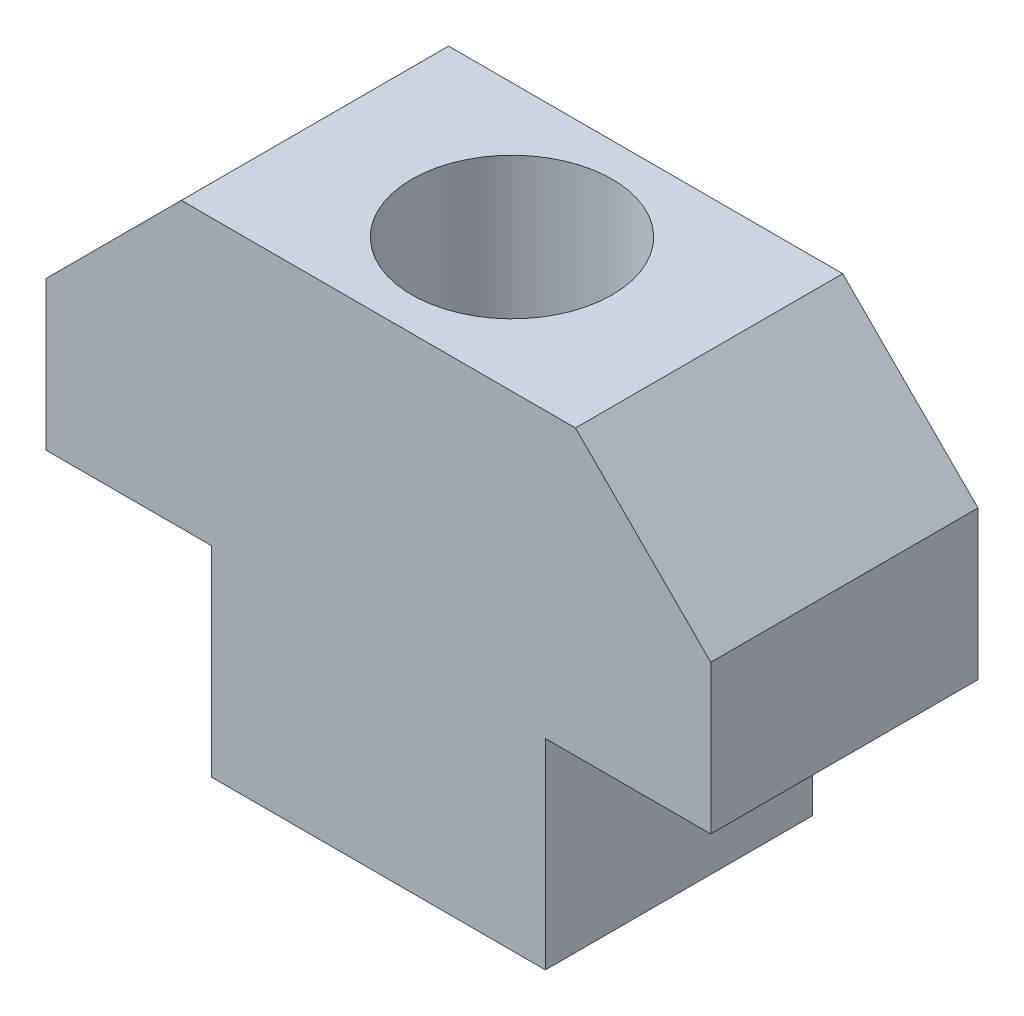
ISO-10303-21;
HEADER;
FILE_DESCRIPTION(('STEP AP214'),'2;1');
FILE_NAME('part.step','',(''),(''),'','','');
FILE_SCHEMA(('AUTOMOTIVE_DESIGN { 1 0 10303 214 1 1 1 1 }'));
ENDSEC;
DATA;
#1=APPLICATION_CONTEXT('core data for automotive mechanical design processes');
#2=APPLICATION_PROTOCOL_DEFINITION('international standard','automotive_design',2000,#1);
#3=PRODUCT_CONTEXT('',#1,'mechanical');
#4=PRODUCT('Part','Part','',(#3));
#5=PRODUCT_RELATED_PRODUCT_CATEGORY('part','',(#4));
#6=PRODUCT_DEFINITION_FORMATION('','',#4);
#7=PRODUCT_DEFINITION_CONTEXT('part definition',#1,'design');
#8=PRODUCT_DEFINITION('design','',#6,#7);
#9=PRODUCT_DEFINITION_SHAPE('','',#8);
#10=(LENGTH_UNIT() NAMED_UNIT(*) SI_UNIT(.MILLI.,.METRE.));
#11=(NAMED_UNIT(*) PLANE_ANGLE_UNIT() SI_UNIT($,.RADIAN.));
#12=(NAMED_UNIT(*) SI_UNIT($,.STERADIAN.) SOLID_ANGLE_UNIT());
#13=UNCERTAINTY_MEASURE_WITH_UNIT(LENGTH_MEASURE(1.E-05),#10,'distance_accuracy_value','');
#14=(GEOMETRIC_REPRESENTATION_CONTEXT(3) GLOBAL_UNCERTAINTY_ASSIGNED_CONTEXT((#13)) GLOBAL_UNIT_ASSIGNED_CONTEXT((#10,
#11,#12)) REPRESENTATION_CONTEXT('',''));
#15=CARTESIAN_POINT('',(0.,0.,0.));
#16=DIRECTION('',(0.,0.,1.));
#17=DIRECTION('',(1.,0.,0.));
#18=AXIS2_PLACEMENT_3D('',#15,#16,#17);
#19=CARTESIAN_POINT('',(5.9,14.5,4.));
#20=DIRECTION('',(0.,-1.,0.));
#21=DIRECTION('',(1.,0.,0.));
#22=AXIS2_PLACEMENT_3D('',#19,#20,#21);
#23=PLANE('',#22);
#24=DIRECTION('',(-1.,0.,0.));
#25=VECTOR('',#24,1.);
#26=CARTESIAN_POINT('',(5.9,14.5,-4.));
#27=LINE('',#26,#25);
#28=CARTESIAN_POINT('',(5.9,14.5,-4.));
#29=VERTEX_POINT('',#28);
#30=CARTESIAN_POINT('',(-5.9,14.5,-4.));
#31=VERTEX_POINT('',#30);
#32=EDGE_CURVE('E153',#29,#31,#27,.T.);
#33=ORIENTED_EDGE('',*,*,#32,.T.);
#34=DIRECTION('',(0.,0.,-1.));
#35=VECTOR('',#34,1.);
#36=CARTESIAN_POINT('',(-5.9,14.5,4.));
#37=LINE('',#36,#35);
#38=CARTESIAN_POINT('',(-5.9,14.5,4.));
#39=VERTEX_POINT('',#38);
#40=EDGE_CURVE('E169',#39,#31,#37,.T.);
#41=ORIENTED_EDGE('',*,*,#40,.F.);
#42=DIRECTION('',(-1.,0.,0.));
#43=VECTOR('',#42,1.);
#44=CARTESIAN_POINT('',(5.9,14.5,4.));
#45=LINE('',#44,#43);
#46=CARTESIAN_POINT('',(5.9,14.5,4.));
#47=VERTEX_POINT('',#46);
#48=EDGE_CURVE('E198',#47,#39,#45,.T.);
#49=ORIENTED_EDGE('',*,*,#48,.F.);
#50=DIRECTION('',(0.,0.,-1.));
#51=VECTOR('',#50,1.);
#52=CARTESIAN_POINT('',(5.9,14.5,4.));
#53=LINE('',#52,#51);
#54=EDGE_CURVE('E172',#47,#29,#53,.T.);
#55=ORIENTED_EDGE('',*,*,#54,.T.);
#56=EDGE_LOOP('',(#33,#41,#49,#55));
#57=FACE_BOUND('',#56,.T.);
#58=CARTESIAN_POINT('',(0.,14.5,0.));
#59=DIRECTION('',(0.,-1.,0.));
#60=DIRECTION('',(1.,0.,0.));
#61=AXIS2_PLACEMENT_3D('',#58,#59,#60);
#62=CIRCLE('',#61,3.);
#63=CARTESIAN_POINT('',(3.,14.5,0.));
#64=VERTEX_POINT('',#63);
#65=EDGE_CURVE('E209',#64,#64,#62,.T.);
#66=ORIENTED_EDGE('',*,*,#65,.T.);
#67=EDGE_LOOP('',(#66));
#68=FACE_BOUND('',#67,.T.);
#69=ADVANCED_FACE('F34',(#57,#68),#23,.F.);
#70=CARTESIAN_POINT('',(-5.,0.,4.));
#71=DIRECTION('',(0.,1.,0.));
#72=DIRECTION('',(-1.,0.,0.));
#73=AXIS2_PLACEMENT_3D('',#70,#71,#72);
#74=PLANE('',#73);
#75=DIRECTION('',(1.,0.,0.));
#76=VECTOR('',#75,1.);
#77=CARTESIAN_POINT('',(-5.,0.,-4.));
#78=LINE('',#77,#76);
#79=CARTESIAN_POINT('',(-5.,0.,-4.));
#80=VERTEX_POINT('',#79);
#81=CARTESIAN_POINT('',(5.,0.,-4.));
#82=VERTEX_POINT('',#81);
#83=EDGE_CURVE('E92',#80,#82,#78,.T.);
#84=ORIENTED_EDGE('',*,*,#83,.T.);
#85=DIRECTION('',(0.,0.,-1.));
#86=VECTOR('',#85,1.);
#87=CARTESIAN_POINT('',(5.,0.,4.));
#88=LINE('',#87,#86);
#89=CARTESIAN_POINT('',(5.,0.,4.));
#90=VERTEX_POINT('',#89);
#91=EDGE_CURVE('E139',#90,#82,#88,.T.);
#92=ORIENTED_EDGE('',*,*,#91,.F.);
#93=DIRECTION('',(1.,0.,0.));
#94=VECTOR('',#93,1.);
#95=CARTESIAN_POINT('',(-5.,0.,4.));
#96=LINE('',#95,#94);
#97=CARTESIAN_POINT('',(-5.,0.,4.));
#98=VERTEX_POINT('',#97);
#99=EDGE_CURVE('E51',#98,#90,#96,.T.);
#100=ORIENTED_EDGE('',*,*,#99,.F.);
#101=DIRECTION('',(0.,0.,-1.));
#102=VECTOR('',#101,1.);
#103=CARTESIAN_POINT('',(-5.,0.,4.));
#104=LINE('',#103,#102);
#105=EDGE_CURVE('E135',#98,#80,#104,.T.);
#106=ORIENTED_EDGE('',*,*,#105,.T.);
#107=EDGE_LOOP('',(#84,#92,#100,#106));
#108=FACE_BOUND('',#107,.T.);
#109=CARTESIAN_POINT('',(0.,0.,0.));
#110=DIRECTION('',(0.,1.,0.));
#111=DIRECTION('',(0.,0.,1.));
#112=AXIS2_PLACEMENT_3D('',#109,#110,#111);
#113=CIRCLE('',#112,3.);
#114=CARTESIAN_POINT('',(0.,0.,3.));
#115=VERTEX_POINT('',#114);
#116=EDGE_CURVE('E147',#115,#115,#113,.T.);
#117=ORIENTED_EDGE('',*,*,#116,.T.);
#118=EDGE_LOOP('',(#117));
#119=FACE_BOUND('',#118,.T.);
#120=ADVANCED_FACE('F215',(#108,#119),#74,.F.);
#121=CARTESIAN_POINT('',(5.,0.,4.));
#122=DIRECTION('',(-1.,0.,0.));
#123=DIRECTION('',(0.,0.,1.));
#124=AXIS2_PLACEMENT_3D('',#121,#122,#123);
#125=PLANE('',#124);
#126=DIRECTION('',(0.,1.,0.));
#127=VECTOR('',#126,1.);
#128=CARTESIAN_POINT('',(5.,0.,-4.));
#129=LINE('',#128,#127);
#130=CARTESIAN_POINT('',(5.,6.,-4.));
#131=VERTEX_POINT('',#130);
#132=EDGE_CURVE('E143',#82,#131,#129,.T.);
#133=ORIENTED_EDGE('',*,*,#132,.T.);
#134=DIRECTION('',(0.,0.,-1.));
#135=VECTOR('',#134,1.);
#136=CARTESIAN_POINT('',(5.,6.,4.));
#137=LINE('',#136,#135);
#138=CARTESIAN_POINT('',(5.,6.,4.));
#139=VERTEX_POINT('',#138);
#140=EDGE_CURVE('E11',#139,#131,#137,.T.);
#141=ORIENTED_EDGE('',*,*,#140,.F.);
#142=DIRECTION('',(0.,1.,0.));
#143=VECTOR('',#142,1.);
#144=CARTESIAN_POINT('',(5.,0.,4.));
#145=LINE('',#144,#143);
#146=EDGE_CURVE('E162',#90,#139,#145,.T.);
#147=ORIENTED_EDGE('',*,*,#146,.F.);
#148=ORIENTED_EDGE('',*,*,#91,.T.);
#149=EDGE_LOOP('',(#133,#141,#147,#148));
#150=FACE_BOUND('',#149,.T.);
#151=ADVANCED_FACE('F36',(#150),#125,.F.);
#152=CARTESIAN_POINT('',(5.,6.,4.));
#153=DIRECTION('',(0.,1.,0.));
#154=DIRECTION('',(-1.,0.,0.));
#155=AXIS2_PLACEMENT_3D('',#152,#153,#154);
#156=PLANE('',#155);
#157=DIRECTION('',(1.,0.,0.));
#158=VECTOR('',#157,1.);
#159=CARTESIAN_POINT('',(5.,6.,-4.));
#160=LINE('',#159,#158);
#161=CARTESIAN_POINT('',(9.95,6.,-4.));
#162=VERTEX_POINT('',#161);
#163=EDGE_CURVE('E146',#131,#162,#160,.T.);
#164=ORIENTED_EDGE('',*,*,#163,.T.);
#165=DIRECTION('',(0.,0.,-1.));
#166=VECTOR('',#165,1.);
#167=CARTESIAN_POINT('',(9.95,6.,4.));
#168=LINE('',#167,#166);
#169=CARTESIAN_POINT('',(9.95,6.,4.));
#170=VERTEX_POINT('',#169);
#171=EDGE_CURVE('E43',#170,#162,#168,.T.);
#172=ORIENTED_EDGE('',*,*,#171,.F.);
#173=DIRECTION('',(1.,0.,0.));
#174=VECTOR('',#173,1.);
#175=CARTESIAN_POINT('',(5.,6.,4.));
#176=LINE('',#175,#174);
#177=EDGE_CURVE('E100',#139,#170,#176,.T.);
#178=ORIENTED_EDGE('',*,*,#177,.F.);
#179=ORIENTED_EDGE('',*,*,#140,.T.);
#180=EDGE_LOOP('',(#164,#172,#178,#179));
#181=FACE_BOUND('',#180,.T.);
#182=ADVANCED_FACE('F235',(#181),#156,.F.);
#183=CARTESIAN_POINT('',(9.95,6.,4.));
#184=DIRECTION('',(-1.,0.,0.));
#185=DIRECTION('',(0.,-1.,0.));
#186=AXIS2_PLACEMENT_3D('',#183,#184,#185);
#187=PLANE('',#186);
#188=DIRECTION('',(0.,1.,0.));
#189=VECTOR('',#188,1.);
#190=CARTESIAN_POINT('',(9.95,6.,-4.));
#191=LINE('',#190,#189);
#192=CARTESIAN_POINT('',(9.95,10.45,-4.));
#193=VERTEX_POINT('',#192);
#194=EDGE_CURVE('E149',#162,#193,#191,.T.);
#195=ORIENTED_EDGE('',*,*,#194,.T.);
#196=DIRECTION('',(0.,0.,-1.));
#197=VECTOR('',#196,1.);
#198=CARTESIAN_POINT('',(9.95,10.45,4.));
#199=LINE('',#198,#197);
#200=CARTESIAN_POINT('',(9.95,10.45,4.));
#201=VERTEX_POINT('',#200);
#202=EDGE_CURVE('E175',#201,#193,#199,.T.);
#203=ORIENTED_EDGE('',*,*,#202,.F.);
#204=DIRECTION('',(0.,1.,0.));
#205=VECTOR('',#204,1.);
#206=CARTESIAN_POINT('',(9.95,6.,4.));
#207=LINE('',#206,#205);
#208=EDGE_CURVE('E183',#170,#201,#207,.T.);
#209=ORIENTED_EDGE('',*,*,#208,.F.);
#210=ORIENTED_EDGE('',*,*,#171,.T.);
#211=EDGE_LOOP('',(#195,#203,#209,#210));
#212=FACE_BOUND('',#211,.T.);
#213=ADVANCED_FACE('F181',(#212),#187,.F.);
#214=CARTESIAN_POINT('',(9.95,10.45,4.));
#215=DIRECTION('',(-0.707106781186549,-0.707106781186546,0.));
#216=DIRECTION('',(0.707106781186546,-0.707106781186549,0.));
#217=AXIS2_PLACEMENT_3D('',#214,#215,#216);
#218=PLANE('',#217);
#219=DIRECTION('',(-0.707106781186546,0.707106781186549,0.));
#220=VECTOR('',#219,1.);
#221=CARTESIAN_POINT('',(9.95,10.45,-4.));
#222=LINE('',#221,#220);
#223=EDGE_CURVE('E151',#193,#29,#222,.T.);
#224=ORIENTED_EDGE('',*,*,#223,.T.);
#225=ORIENTED_EDGE('',*,*,#54,.F.);
#226=DIRECTION('',(-0.707106781186546,0.707106781186549,0.));
#227=VECTOR('',#226,1.);
#228=CARTESIAN_POINT('',(9.95,10.45,4.));
#229=LINE('',#228,#227);
#230=EDGE_CURVE('E201',#201,#47,#229,.T.);
#231=ORIENTED_EDGE('',*,*,#230,.F.);
#232=ORIENTED_EDGE('',*,*,#202,.T.);
#233=EDGE_LOOP('',(#224,#225,#231,#232));
#234=FACE_BOUND('',#233,.T.);
#235=ADVANCED_FACE('F192',(#234),#218,.F.);
#236=CARTESIAN_POINT('',(-5.9,14.5,4.));
#237=DIRECTION('',(0.707106781186549,-0.707106781186546,0.));
#238=DIRECTION('',(0.707106781186546,0.707106781186549,0.));
#239=AXIS2_PLACEMENT_3D('',#236,#237,#238);
#240=PLANE('',#239);
#241=DIRECTION('',(-0.707106781186546,-0.707106781186549,0.));
#242=VECTOR('',#241,1.);
#243=CARTESIAN_POINT('',(-5.9,14.5,-4.));
#244=LINE('',#243,#242);
#245=CARTESIAN_POINT('',(-9.95,10.45,-4.));
#246=VERTEX_POINT('',#245);
#247=EDGE_CURVE('E155',#31,#246,#244,.T.);
#248=ORIENTED_EDGE('',*,*,#247,.T.);
#249=DIRECTION('',(0.,0.,-1.));
#250=VECTOR('',#249,1.);
#251=CARTESIAN_POINT('',(-9.95,10.45,4.));
#252=LINE('',#251,#250);
#253=CARTESIAN_POINT('',(-9.95,10.45,4.));
#254=VERTEX_POINT('',#253);
#255=EDGE_CURVE('E166',#254,#246,#252,.T.);
#256=ORIENTED_EDGE('',*,*,#255,.F.);
#257=DIRECTION('',(-0.707106781186546,-0.707106781186549,0.));
#258=VECTOR('',#257,1.);
#259=CARTESIAN_POINT('',(-5.9,14.5,4.));
#260=LINE('',#259,#258);
#261=EDGE_CURVE('E200',#39,#254,#260,.T.);
#262=ORIENTED_EDGE('',*,*,#261,.F.);
#263=ORIENTED_EDGE('',*,*,#40,.T.);
#264=EDGE_LOOP('',(#248,#256,#262,#263));
#265=FACE_BOUND('',#264,.T.);
#266=ADVANCED_FACE('F230',(#265),#240,.F.);
#267=CARTESIAN_POINT('',(-9.95,10.45,4.));
#268=DIRECTION('',(1.,0.,0.));
#269=DIRECTION('',(0.,1.,0.));
#270=AXIS2_PLACEMENT_3D('',#267,#268,#269);
#271=PLANE('',#270);
#272=DIRECTION('',(0.,-1.,0.));
#273=VECTOR('',#272,1.);
#274=CARTESIAN_POINT('',(-9.95,10.45,-4.));
#275=LINE('',#274,#273);
#276=CARTESIAN_POINT('',(-9.95,6.,-4.));
#277=VERTEX_POINT('',#276);
#278=EDGE_CURVE('E157',#246,#277,#275,.T.);
#279=ORIENTED_EDGE('',*,*,#278,.T.);
#280=DIRECTION('',(0.,0.,-1.));
#281=VECTOR('',#280,1.);
#282=CARTESIAN_POINT('',(-9.95,6.,4.));
#283=LINE('',#282,#281);
#284=CARTESIAN_POINT('',(-9.95,6.,4.));
#285=VERTEX_POINT('',#284);
#286=EDGE_CURVE('E134',#285,#277,#283,.T.);
#287=ORIENTED_EDGE('',*,*,#286,.F.);
#288=DIRECTION('',(0.,-1.,0.));
#289=VECTOR('',#288,1.);
#290=CARTESIAN_POINT('',(-9.95,10.45,4.));
#291=LINE('',#290,#289);
#292=EDGE_CURVE('E125',#254,#285,#291,.T.);
#293=ORIENTED_EDGE('',*,*,#292,.F.);
#294=ORIENTED_EDGE('',*,*,#255,.T.);
#295=EDGE_LOOP('',(#279,#287,#293,#294));
#296=FACE_BOUND('',#295,.T.);
#297=ADVANCED_FACE('F245',(#296),#271,.F.);
#298=CARTESIAN_POINT('',(-9.95,6.,4.));
#299=DIRECTION('',(0.,1.,0.));
#300=DIRECTION('',(0.,0.,1.));
#301=AXIS2_PLACEMENT_3D('',#298,#299,#300);
#302=PLANE('',#301);
#303=DIRECTION('',(1.,0.,0.));
#304=VECTOR('',#303,1.);
#305=CARTESIAN_POINT('',(-9.95,6.,-4.));
#306=LINE('',#305,#304);
#307=CARTESIAN_POINT('',(-5.,6.,-4.));
#308=VERTEX_POINT('',#307);
#309=EDGE_CURVE('E133',#277,#308,#306,.T.);
#310=ORIENTED_EDGE('',*,*,#309,.T.);
#311=DIRECTION('',(0.,0.,-1.));
#312=VECTOR('',#311,1.);
#313=CARTESIAN_POINT('',(-5.,6.,4.));
#314=LINE('',#313,#312);
#315=CARTESIAN_POINT('',(-5.,6.,4.));
#316=VERTEX_POINT('',#315);
#317=EDGE_CURVE('E130',#316,#308,#314,.T.);
#318=ORIENTED_EDGE('',*,*,#317,.F.);
#319=DIRECTION('',(1.,0.,0.));
#320=VECTOR('',#319,1.);
#321=CARTESIAN_POINT('',(-9.95,6.,4.));
#322=LINE('',#321,#320);
#323=EDGE_CURVE('E119',#285,#316,#322,.T.);
#324=ORIENTED_EDGE('',*,*,#323,.F.);
#325=ORIENTED_EDGE('',*,*,#286,.T.);
#326=EDGE_LOOP('',(#310,#318,#324,#325));
#327=FACE_BOUND('',#326,.T.);
#328=ADVANCED_FACE('F131',(#327),#302,.F.);
#329=CARTESIAN_POINT('',(-5.,6.,4.));
#330=DIRECTION('',(1.,0.,0.));
#331=DIRECTION('',(0.,1.,0.));
#332=AXIS2_PLACEMENT_3D('',#329,#330,#331);
#333=PLANE('',#332);
#334=DIRECTION('',(0.,-1.,0.));
#335=VECTOR('',#334,1.);
#336=CARTESIAN_POINT('',(-5.,6.,-4.));
#337=LINE('',#336,#335);
#338=EDGE_CURVE('E86',#308,#80,#337,.T.);
#339=ORIENTED_EDGE('',*,*,#338,.T.);
#340=ORIENTED_EDGE('',*,*,#105,.F.);
#341=DIRECTION('',(0.,-1.,0.));
#342=VECTOR('',#341,1.);
#343=CARTESIAN_POINT('',(-5.,6.,4.));
#344=LINE('',#343,#342);
#345=EDGE_CURVE('E123',#316,#98,#344,.T.);
#346=ORIENTED_EDGE('',*,*,#345,.F.);
#347=ORIENTED_EDGE('',*,*,#317,.T.);
#348=EDGE_LOOP('',(#339,#340,#346,#347));
#349=FACE_BOUND('',#348,.T.);
#350=ADVANCED_FACE('F137',(#349),#333,.F.);
#351=CARTESIAN_POINT('',(5.,6.,4.));
#352=DIRECTION('',(0.,0.,-1.));
#353=DIRECTION('',(-1.,0.,0.));
#354=AXIS2_PLACEMENT_3D('',#351,#352,#353);
#355=PLANE('',#354);
#356=ORIENTED_EDGE('',*,*,#146,.T.);
#357=ORIENTED_EDGE('',*,*,#177,.T.);
#358=ORIENTED_EDGE('',*,*,#208,.T.);
#359=ORIENTED_EDGE('',*,*,#230,.T.);
#360=ORIENTED_EDGE('',*,*,#48,.T.);
#361=ORIENTED_EDGE('',*,*,#261,.T.);
#362=ORIENTED_EDGE('',*,*,#292,.T.);
#363=ORIENTED_EDGE('',*,*,#323,.T.);
#364=ORIENTED_EDGE('',*,*,#345,.T.);
#365=ORIENTED_EDGE('',*,*,#99,.T.);
#366=EDGE_LOOP('',(#356,#357,#358,#359,#360,#361,#362,#363,#364,#365));
#367=FACE_BOUND('',#366,.T.);
#368=ADVANCED_FACE('F121',(#367),#355,.F.);
#369=CARTESIAN_POINT('',(5.,6.,-4.));
#370=DIRECTION('',(0.,0.,-1.));
#371=DIRECTION('',(-1.,0.,0.));
#372=AXIS2_PLACEMENT_3D('',#369,#370,#371);
#373=PLANE('',#372);
#374=ORIENTED_EDGE('',*,*,#132,.F.);
#375=ORIENTED_EDGE('',*,*,#83,.F.);
#376=ORIENTED_EDGE('',*,*,#338,.F.);
#377=ORIENTED_EDGE('',*,*,#309,.F.);
#378=ORIENTED_EDGE('',*,*,#278,.F.);
#379=ORIENTED_EDGE('',*,*,#247,.F.);
#380=ORIENTED_EDGE('',*,*,#32,.F.);
#381=ORIENTED_EDGE('',*,*,#223,.F.);
#382=ORIENTED_EDGE('',*,*,#194,.F.);
#383=ORIENTED_EDGE('',*,*,#163,.F.);
#384=EDGE_LOOP('',(#374,#375,#376,#377,#378,#379,#380,#381,#382,#383));
#385=FACE_BOUND('',#384,.T.);
#386=ADVANCED_FACE('F187',(#385),#373,.T.);
#387=CARTESIAN_POINT('',(0.,14.501,0.));
#388=DIRECTION('',(0.,-1.,0.));
#389=DIRECTION('',(0.,0.,-1.));
#390=AXIS2_PLACEMENT_3D('',#387,#388,#389);
#391=CYLINDRICAL_SURFACE('',#390,3.);
#392=ORIENTED_EDGE('',*,*,#116,.F.);
#393=EDGE_LOOP('',(#392));
#394=FACE_BOUND('',#393,.T.);
#395=ORIENTED_EDGE('',*,*,#65,.F.);
#396=EDGE_LOOP('',(#395));
#397=FACE_BOUND('',#396,.T.);
#398=ADVANCED_FACE('F217',(#394,#397),#391,.F.);
#399=CLOSED_SHELL('',(#69,#120,#151,#182,#213,#235,#266,#297,#328,#350,#368,#386,#398));
#400=MANIFOLD_SOLID_BREP('B2',#399);
#401=ADVANCED_BREP_SHAPE_REPRESENTATION('',(#18,#400),#14);
#402=SHAPE_DEFINITION_REPRESENTATION(#9,#401);
ENDSEC;
END-ISO-10303-21;
